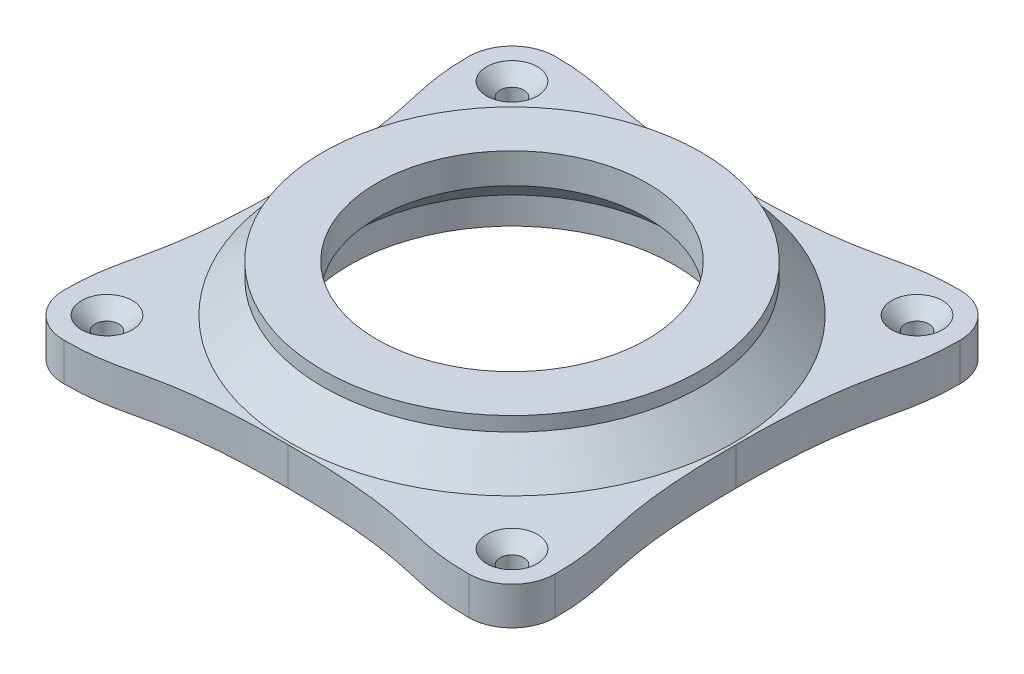
ISO-10303-21;
HEADER;
FILE_DESCRIPTION(('STEP AP214'),'2;1');
FILE_NAME('part.step','',(''),(''),'','','');
FILE_SCHEMA(('AUTOMOTIVE_DESIGN { 1 0 10303 214 1 1 1 1 }'));
ENDSEC;
DATA;
#1=APPLICATION_CONTEXT('core data for automotive mechanical design processes');
#2=APPLICATION_PROTOCOL_DEFINITION('international standard','automotive_design',2000,#1);
#3=PRODUCT_CONTEXT('',#1,'mechanical');
#4=PRODUCT('Part','Part','',(#3));
#5=PRODUCT_RELATED_PRODUCT_CATEGORY('part','',(#4));
#6=PRODUCT_DEFINITION_FORMATION('','',#4);
#7=PRODUCT_DEFINITION_CONTEXT('part definition',#1,'design');
#8=PRODUCT_DEFINITION('design','',#6,#7);
#9=PRODUCT_DEFINITION_SHAPE('','',#8);
#10=(LENGTH_UNIT() NAMED_UNIT(*) SI_UNIT(.MILLI.,.METRE.));
#11=(NAMED_UNIT(*) PLANE_ANGLE_UNIT() SI_UNIT($,.RADIAN.));
#12=(NAMED_UNIT(*) SI_UNIT($,.STERADIAN.) SOLID_ANGLE_UNIT());
#13=UNCERTAINTY_MEASURE_WITH_UNIT(LENGTH_MEASURE(1.E-05),#10,'distance_accuracy_value','');
#14=(GEOMETRIC_REPRESENTATION_CONTEXT(3) GLOBAL_UNCERTAINTY_ASSIGNED_CONTEXT((#13)) GLOBAL_UNIT_ASSIGNED_CONTEXT((#10,
#11,#12)) REPRESENTATION_CONTEXT('',''));
#15=CARTESIAN_POINT('',(0.,0.,0.));
#16=DIRECTION('',(0.,0.,1.));
#17=DIRECTION('',(1.,0.,0.));
#18=AXIS2_PLACEMENT_3D('',#15,#16,#17);
#19=CARTESIAN_POINT('',(0.,7.,0.));
#20=DIRECTION('',(0.,1.,0.));
#21=DIRECTION('',(0.,0.,1.));
#22=AXIS2_PLACEMENT_3D('',#19,#20,#21);
#23=PLANE('',#22);
#24=CARTESIAN_POINT('',(37.5,7.,-37.5));
#25=DIRECTION('',(0.,1.,0.));
#26=DIRECTION('',(0.,0.,1.));
#27=AXIS2_PLACEMENT_3D('',#24,#25,#26);
#28=CIRCLE('',#27,41.);
#29=CARTESIAN_POINT('',(37.5,7.,3.50000000000002));
#30=VERTEX_POINT('',#29);
#31=EDGE_CURVE('E11',#30,#30,#28,.F.);
#32=ORIENTED_EDGE('',*,*,#31,.T.);
#33=EDGE_LOOP('',(#32));
#34=FACE_BOUND('',#33,.T.);
#35=CARTESIAN_POINT('',(0.,7.,-75.));
#36=DIRECTION('',(0.,1.,0.));
#37=DIRECTION('',(0.,0.,1.));
#38=AXIS2_PLACEMENT_3D('',#35,#36,#37);
#39=CIRCLE('',#38,4.70000000000002);
#40=CARTESIAN_POINT('',(0.,7.,-70.3));
#41=VERTEX_POINT('',#40);
#42=EDGE_CURVE('E309',#41,#41,#39,.F.);
#43=ORIENTED_EDGE('',*,*,#42,.T.);
#44=EDGE_LOOP('',(#43));
#45=FACE_BOUND('',#44,.T.);
#46=CARTESIAN_POINT('',(0.,7.,0.));
#47=DIRECTION('',(0.,1.,0.));
#48=DIRECTION('',(0.,0.,1.));
#49=AXIS2_PLACEMENT_3D('',#46,#47,#48);
#50=CIRCLE('',#49,4.70000000000002);
#51=CARTESIAN_POINT('',(0.,7.,4.70000000000002));
#52=VERTEX_POINT('',#51);
#53=EDGE_CURVE('E306',#52,#52,#50,.F.);
#54=ORIENTED_EDGE('',*,*,#53,.T.);
#55=EDGE_LOOP('',(#54));
#56=FACE_BOUND('',#55,.T.);
#57=CARTESIAN_POINT('',(75.,7.,0.));
#58=DIRECTION('',(0.,1.,0.));
#59=DIRECTION('',(0.,0.,1.));
#60=AXIS2_PLACEMENT_3D('',#57,#58,#59);
#61=CIRCLE('',#60,4.70000000000002);
#62=CARTESIAN_POINT('',(75.,7.,4.70000000000002));
#63=VERTEX_POINT('',#62);
#64=EDGE_CURVE('E303',#63,#63,#61,.F.);
#65=ORIENTED_EDGE('',*,*,#64,.T.);
#66=EDGE_LOOP('',(#65));
#67=FACE_BOUND('',#66,.T.);
#68=CARTESIAN_POINT('',(75.0000000000007,7.,-75.0000000000004));
#69=DIRECTION('',(0.,1.,0.));
#70=DIRECTION('',(0.,0.,1.));
#71=AXIS2_PLACEMENT_3D('',#68,#69,#70);
#72=CIRCLE('',#71,4.69999999999998);
#73=CARTESIAN_POINT('',(75.0000000000007,7.,-70.3000000000004));
#74=VERTEX_POINT('',#73);
#75=EDGE_CURVE('E300',#74,#74,#72,.F.);
#76=ORIENTED_EDGE('',*,*,#75,.T.);
#77=EDGE_LOOP('',(#76));
#78=FACE_BOUND('',#77,.T.);
#79=CARTESIAN_POINT('',(0.,7.,-75.));
#80=DIRECTION('',(0.,1.,0.));
#81=DIRECTION('',(0.,0.,1.));
#82=AXIS2_PLACEMENT_3D('',#79,#80,#81);
#83=CIRCLE('',#82,8.);
#84=CARTESIAN_POINT('',(0.,7.,-83.));
#85=VERTEX_POINT('',#84);
#86=CARTESIAN_POINT('',(-8.,7.,-75.));
#87=VERTEX_POINT('',#86);
#88=EDGE_CURVE('E386',#85,#87,#83,.T.);
#89=ORIENTED_EDGE('',*,*,#88,.T.);
#90=CARTESIAN_POINT('',(-7.99999999999906,7.,-74.9999999999999));
#91=CARTESIAN_POINT('',(-7.99999999999922,7.,-62.4999999999999));
#92=CARTESIAN_POINT('',(-4.,7.,-62.5));
#93=CARTESIAN_POINT('',(-4.,7.,-37.5));
#94=B_SPLINE_CURVE_WITH_KNOTS('',3,(#90,#91,#92,#93),.UNSPECIFIED.,.F.,.F.,(4,4),(0.,1.),.UNSPECIFIED.);
#95=CARTESIAN_POINT('',(-4.,7.,-37.5));
#96=VERTEX_POINT('',#95);
#97=EDGE_CURVE('E109',#87,#96,#94,.T.);
#98=ORIENTED_EDGE('',*,*,#97,.T.);
#99=CARTESIAN_POINT('',(-7.99999999999987,7.,0.));
#100=CARTESIAN_POINT('',(-7.99999999999974,7.,-12.4999999999999));
#101=CARTESIAN_POINT('',(-4.00000000000002,7.,-12.5));
#102=CARTESIAN_POINT('',(-4.,7.,-37.5));
#103=B_SPLINE_CURVE_WITH_KNOTS('',3,(#99,#100,#101,#102),.UNSPECIFIED.,.F.,.F.,(4,4),(0.,1.),.UNSPECIFIED.);
#104=CARTESIAN_POINT('',(-7.99999999999915,7.,-2.93902320845243E-13));
#105=VERTEX_POINT('',#104);
#106=EDGE_CURVE('E238',#105,#96,#103,.T.);
#107=ORIENTED_EDGE('',*,*,#106,.F.);
#108=CARTESIAN_POINT('',(8.46545056276682E-13,7.,-2.4980018054066E-13));
#109=DIRECTION('',(0.,1.,0.));
#110=DIRECTION('',(0.,0.,1.));
#111=AXIS2_PLACEMENT_3D('',#108,#109,#110);
#112=CIRCLE('',#111,8.);
#113=CARTESIAN_POINT('',(8.46545056276682E-13,7.,7.99999999999975));
#114=VERTEX_POINT('',#113);
#115=EDGE_CURVE('E243',#105,#114,#112,.T.);
#116=ORIENTED_EDGE('',*,*,#115,.T.);
#117=CARTESIAN_POINT('',(7.91033905045424E-13,7.,7.99999999999974));
#118=CARTESIAN_POINT('',(12.5000000000008,7.,7.99999999999985));
#119=CARTESIAN_POINT('',(12.5,7.,4.00000000000005));
#120=CARTESIAN_POINT('',(37.5,7.,4.00000000000003));
#121=B_SPLINE_CURVE_WITH_KNOTS('',3,(#117,#118,#119,#120),.UNSPECIFIED.,.F.,.F.,(4,4),(0.,1.),.UNSPECIFIED.);
#122=CARTESIAN_POINT('',(37.5,7.,4.00000000000003));
#123=VERTEX_POINT('',#122);
#124=EDGE_CURVE('E208',#114,#123,#121,.T.);
#125=ORIENTED_EDGE('',*,*,#124,.T.);
#126=CARTESIAN_POINT('',(75.0000000000008,7.,8.00000000000028));
#127=CARTESIAN_POINT('',(62.5000000000008,7.,8.0000000000002));
#128=CARTESIAN_POINT('',(62.5,7.,4.00000000000003));
#129=CARTESIAN_POINT('',(37.5,7.,4.00000000000003));
#130=B_SPLINE_CURVE_WITH_KNOTS('',3,(#126,#127,#128,#129),.UNSPECIFIED.,.F.,.F.,(4,4),(0.,1.),.UNSPECIFIED.);
#131=CARTESIAN_POINT('',(75.0000000000005,7.,7.99999999999959));
#132=VERTEX_POINT('',#131);
#133=EDGE_CURVE('E202',#132,#123,#130,.T.);
#134=ORIENTED_EDGE('',*,*,#133,.F.);
#135=CARTESIAN_POINT('',(75.0000000000005,7.,-4.02455846426619E-13));
#136=DIRECTION('',(0.,1.,0.));
#137=DIRECTION('',(0.,0.,1.));
#138=AXIS2_PLACEMENT_3D('',#135,#136,#137);
#139=CIRCLE('',#138,7.99999999999999);
#140=CARTESIAN_POINT('',(83.0000000000005,7.,-3.73544278276556E-13));
#141=VERTEX_POINT('',#140);
#142=EDGE_CURVE('E197',#132,#141,#139,.T.);
#143=ORIENTED_EDGE('',*,*,#142,.T.);
#144=CARTESIAN_POINT('',(83.0000000000004,7.,-3.7470027081099E-13));
#145=CARTESIAN_POINT('',(83.0000000000005,7.,-12.5000000000004));
#146=CARTESIAN_POINT('',(79.,7.,-12.5));
#147=CARTESIAN_POINT('',(79.,7.,-37.5));
#148=B_SPLINE_CURVE_WITH_KNOTS('',3,(#144,#145,#146,#147),.UNSPECIFIED.,.F.,.F.,(4,4),(0.,1.),.UNSPECIFIED.);
#149=CARTESIAN_POINT('',(79.,7.,-37.5));
#150=VERTEX_POINT('',#149);
#151=EDGE_CURVE('E189',#141,#150,#148,.T.);
#152=ORIENTED_EDGE('',*,*,#151,.T.);
#153=CARTESIAN_POINT('',(83.0000000000007,7.,-75.0000000000004));
#154=CARTESIAN_POINT('',(83.0000000000007,7.,-62.5000000000004));
#155=CARTESIAN_POINT('',(79.,7.,-62.5));
#156=CARTESIAN_POINT('',(79.,7.,-37.5));
#157=B_SPLINE_CURVE_WITH_KNOTS('',3,(#153,#154,#155,#156),.UNSPECIFIED.,.F.,.F.,(4,4),(0.,1.),.UNSPECIFIED.);
#158=CARTESIAN_POINT('',(83.0000000000002,7.,-75.));
#159=VERTEX_POINT('',#158);
#160=EDGE_CURVE('E143',#159,#150,#157,.T.);
#161=ORIENTED_EDGE('',*,*,#160,.F.);
#162=CARTESIAN_POINT('',(75.0000000000007,7.,-75.0000000000004));
#163=DIRECTION('',(0.,1.,0.));
#164=DIRECTION('',(0.,0.,1.));
#165=AXIS2_PLACEMENT_3D('',#162,#163,#164);
#166=CIRCLE('',#165,7.99999999999945);
#167=CARTESIAN_POINT('',(75.,7.,-82.9999999999999));
#168=VERTEX_POINT('',#167);
#169=EDGE_CURVE('E137',#159,#168,#166,.T.);
#170=ORIENTED_EDGE('',*,*,#169,.T.);
#171=CARTESIAN_POINT('',(75.,7.,-83.));
#172=CARTESIAN_POINT('',(62.5,7.,-83.));
#173=CARTESIAN_POINT('',(62.5,7.,-79.));
#174=CARTESIAN_POINT('',(37.5,7.,-79.));
#175=B_SPLINE_CURVE_WITH_KNOTS('',3,(#171,#172,#173,#174),.UNSPECIFIED.,.F.,.F.,(4,4),(0.,1.),.UNSPECIFIED.);
#176=CARTESIAN_POINT('',(37.5,7.,-79.));
#177=VERTEX_POINT('',#176);
#178=EDGE_CURVE('E141',#168,#177,#175,.T.);
#179=ORIENTED_EDGE('',*,*,#178,.T.);
#180=CARTESIAN_POINT('',(0.,7.,-83.));
#181=CARTESIAN_POINT('',(12.5,7.,-83.));
#182=CARTESIAN_POINT('',(12.5,7.,-79.));
#183=CARTESIAN_POINT('',(37.5,7.,-79.));
#184=B_SPLINE_CURVE_WITH_KNOTS('',3,(#180,#181,#182,#183),.UNSPECIFIED.,.F.,.F.,(4,4),(0.,1.),.UNSPECIFIED.);
#185=EDGE_CURVE('E156',#85,#177,#184,.T.);
#186=ORIENTED_EDGE('',*,*,#185,.F.);
#187=EDGE_LOOP('',(#89,#98,#107,#116,#125,#134,#143,#152,#161,#170,#179,#186));
#188=FACE_BOUND('',#187,.T.);
#189=ADVANCED_FACE('F39',(#34,#45,#56,#67,#78,#188),#23,.T.);
#190=CARTESIAN_POINT('',(0.,7.,-75.));
#191=DIRECTION('',(0.,-1.,0.));
#192=DIRECTION('',(0.,0.,-1.));
#193=AXIS2_PLACEMENT_3D('',#190,#191,#192);
#194=CYLINDRICAL_SURFACE('',#193,8.);
#195=CARTESIAN_POINT('',(0.,0.,-75.));
#196=DIRECTION('',(0.,1.,0.));
#197=DIRECTION('',(0.,0.,1.));
#198=AXIS2_PLACEMENT_3D('',#195,#196,#197);
#199=CIRCLE('',#198,8.);
#200=CARTESIAN_POINT('',(0.,0.,-83.));
#201=VERTEX_POINT('',#200);
#202=CARTESIAN_POINT('',(-8.,0.,-75.));
#203=VERTEX_POINT('',#202);
#204=EDGE_CURVE('E379',#201,#203,#199,.T.);
#205=ORIENTED_EDGE('',*,*,#204,.T.);
#206=DIRECTION('',(0.,-1.,0.));
#207=VECTOR('',#206,1.);
#208=CARTESIAN_POINT('',(-8.,7.,-75.));
#209=LINE('',#208,#207);
#210=EDGE_CURVE('E295',#87,#203,#209,.T.);
#211=ORIENTED_EDGE('',*,*,#210,.F.);
#212=ORIENTED_EDGE('',*,*,#88,.F.);
#213=DIRECTION('',(0.,-1.,0.));
#214=VECTOR('',#213,1.);
#215=CARTESIAN_POINT('',(0.,7.,-83.));
#216=LINE('',#215,#214);
#217=EDGE_CURVE('E57',#85,#201,#216,.T.);
#218=ORIENTED_EDGE('',*,*,#217,.T.);
#219=EDGE_LOOP('',(#205,#211,#212,#218));
#220=FACE_BOUND('',#219,.T.);
#221=ADVANCED_FACE('F341',(#220),#194,.T.);
#222=DIRECTION('',(0.,-1.,0.));
#223=VECTOR('',#222,1.);
#224=SURFACE_OF_LINEAR_EXTRUSION('',#94,#223);
#225=CARTESIAN_POINT('',(-7.99999999999906,0.,-74.9999999999999));
#226=CARTESIAN_POINT('',(-7.99999999999922,0.,-62.4999999999999));
#227=CARTESIAN_POINT('',(-4.,0.,-62.5));
#228=CARTESIAN_POINT('',(-4.,0.,-37.5));
#229=B_SPLINE_CURVE_WITH_KNOTS('',3,(#225,#226,#227,#228),.UNSPECIFIED.,.F.,.F.,(4,4),(0.,1.),.UNSPECIFIED.);
#230=CARTESIAN_POINT('',(-4.,0.,-37.5));
#231=VERTEX_POINT('',#230);
#232=EDGE_CURVE('E383',#203,#231,#229,.T.);
#233=ORIENTED_EDGE('',*,*,#232,.T.);
#234=DIRECTION('',(0.,-1.,0.));
#235=VECTOR('',#234,1.);
#236=CARTESIAN_POINT('',(-4.,7.,-37.5));
#237=LINE('',#236,#235);
#238=EDGE_CURVE('E293',#96,#231,#237,.T.);
#239=ORIENTED_EDGE('',*,*,#238,.F.);
#240=ORIENTED_EDGE('',*,*,#97,.F.);
#241=ORIENTED_EDGE('',*,*,#210,.T.);
#242=EDGE_LOOP('',(#233,#239,#240,#241));
#243=FACE_BOUND('',#242,.T.);
#244=ADVANCED_FACE('F234',(#243),#224,.F.);
#245=DIRECTION('',(0.,-1.,0.));
#246=VECTOR('',#245,1.);
#247=SURFACE_OF_LINEAR_EXTRUSION('',#103,#246);
#248=CARTESIAN_POINT('',(-7.99999999999987,0.,0.));
#249=CARTESIAN_POINT('',(-7.99999999999974,0.,-12.4999999999999));
#250=CARTESIAN_POINT('',(-4.00000000000002,0.,-12.5));
#251=CARTESIAN_POINT('',(-4.,0.,-37.5));
#252=B_SPLINE_CURVE_WITH_KNOTS('',3,(#248,#249,#250,#251),.UNSPECIFIED.,.F.,.F.,(4,4),(0.,1.),.UNSPECIFIED.);
#253=CARTESIAN_POINT('',(-7.99999999999915,0.,-2.93902320845243E-13));
#254=VERTEX_POINT('',#253);
#255=EDGE_CURVE('E431',#254,#231,#252,.T.);
#256=ORIENTED_EDGE('',*,*,#255,.F.);
#257=DIRECTION('',(0.,-1.,0.));
#258=VECTOR('',#257,1.);
#259=CARTESIAN_POINT('',(-7.99999999999915,7.,-2.93902320845243E-13));
#260=LINE('',#259,#258);
#261=EDGE_CURVE('E291',#105,#254,#260,.T.);
#262=ORIENTED_EDGE('',*,*,#261,.F.);
#263=ORIENTED_EDGE('',*,*,#106,.T.);
#264=ORIENTED_EDGE('',*,*,#238,.T.);
#265=EDGE_LOOP('',(#256,#262,#263,#264));
#266=FACE_BOUND('',#265,.T.);
#267=ADVANCED_FACE('F229',(#266),#247,.T.);
#268=CARTESIAN_POINT('',(8.46545056276682E-13,7.,-2.4980018054066E-13));
#269=DIRECTION('',(0.,-1.,0.));
#270=DIRECTION('',(0.,0.,-1.));
#271=AXIS2_PLACEMENT_3D('',#268,#269,#270);
#272=CYLINDRICAL_SURFACE('',#271,8.);
#273=CARTESIAN_POINT('',(8.46545056276682E-13,0.,-2.4980018054066E-13));
#274=DIRECTION('',(0.,1.,0.));
#275=DIRECTION('',(0.,0.,1.));
#276=AXIS2_PLACEMENT_3D('',#273,#274,#275);
#277=CIRCLE('',#276,8.);
#278=CARTESIAN_POINT('',(8.46545056276682E-13,0.,7.99999999999975));
#279=VERTEX_POINT('',#278);
#280=EDGE_CURVE('E426',#254,#279,#277,.T.);
#281=ORIENTED_EDGE('',*,*,#280,.T.);
#282=DIRECTION('',(0.,-1.,0.));
#283=VECTOR('',#282,1.);
#284=CARTESIAN_POINT('',(8.46545056276682E-13,7.,7.99999999999975));
#285=LINE('',#284,#283);
#286=EDGE_CURVE('E264',#114,#279,#285,.T.);
#287=ORIENTED_EDGE('',*,*,#286,.F.);
#288=ORIENTED_EDGE('',*,*,#115,.F.);
#289=ORIENTED_EDGE('',*,*,#261,.T.);
#290=EDGE_LOOP('',(#281,#287,#288,#289));
#291=FACE_BOUND('',#290,.T.);
#292=ADVANCED_FACE('F225',(#291),#272,.T.);
#293=DIRECTION('',(0.,-1.,0.));
#294=VECTOR('',#293,1.);
#295=SURFACE_OF_LINEAR_EXTRUSION('',#121,#294);
#296=CARTESIAN_POINT('',(7.91033905045424E-13,0.,7.99999999999974));
#297=CARTESIAN_POINT('',(12.5000000000008,0.,7.99999999999985));
#298=CARTESIAN_POINT('',(12.5,0.,4.00000000000005));
#299=CARTESIAN_POINT('',(37.5,0.,4.00000000000003));
#300=B_SPLINE_CURVE_WITH_KNOTS('',3,(#296,#297,#298,#299),.UNSPECIFIED.,.F.,.F.,(4,4),(0.,1.),.UNSPECIFIED.);
#301=CARTESIAN_POINT('',(37.5,0.,4.00000000000003));
#302=VERTEX_POINT('',#301);
#303=EDGE_CURVE('E261',#279,#302,#300,.T.);
#304=ORIENTED_EDGE('',*,*,#303,.T.);
#305=DIRECTION('',(0.,-1.,0.));
#306=VECTOR('',#305,1.);
#307=CARTESIAN_POINT('',(37.5,7.,4.00000000000003));
#308=LINE('',#307,#306);
#309=EDGE_CURVE('E259',#123,#302,#308,.T.);
#310=ORIENTED_EDGE('',*,*,#309,.F.);
#311=ORIENTED_EDGE('',*,*,#124,.F.);
#312=ORIENTED_EDGE('',*,*,#286,.T.);
#313=EDGE_LOOP('',(#304,#310,#311,#312));
#314=FACE_BOUND('',#313,.T.);
#315=ADVANCED_FACE('F221',(#314),#295,.F.);
#316=DIRECTION('',(0.,-1.,0.));
#317=VECTOR('',#316,1.);
#318=SURFACE_OF_LINEAR_EXTRUSION('',#130,#317);
#319=CARTESIAN_POINT('',(75.0000000000008,0.,8.00000000000028));
#320=CARTESIAN_POINT('',(62.5000000000008,0.,8.0000000000002));
#321=CARTESIAN_POINT('',(62.5,0.,4.00000000000003));
#322=CARTESIAN_POINT('',(37.5,0.,4.00000000000003));
#323=B_SPLINE_CURVE_WITH_KNOTS('',3,(#319,#320,#321,#322),.UNSPECIFIED.,.F.,.F.,(4,4),(0.,1.),.UNSPECIFIED.);
#324=CARTESIAN_POINT('',(75.0000000000005,0.,7.99999999999959));
#325=VERTEX_POINT('',#324);
#326=EDGE_CURVE('E268',#325,#302,#323,.T.);
#327=ORIENTED_EDGE('',*,*,#326,.F.);
#328=DIRECTION('',(0.,-1.,0.));
#329=VECTOR('',#328,1.);
#330=CARTESIAN_POINT('',(75.0000000000005,7.,7.99999999999959));
#331=LINE('',#330,#329);
#332=EDGE_CURVE('E265',#132,#325,#331,.T.);
#333=ORIENTED_EDGE('',*,*,#332,.F.);
#334=ORIENTED_EDGE('',*,*,#133,.T.);
#335=ORIENTED_EDGE('',*,*,#309,.T.);
#336=EDGE_LOOP('',(#327,#333,#334,#335));
#337=FACE_BOUND('',#336,.T.);
#338=ADVANCED_FACE('F217',(#337),#318,.T.);
#339=CARTESIAN_POINT('',(75.0000000000005,7.,-4.02455846426619E-13));
#340=DIRECTION('',(0.,-1.,0.));
#341=DIRECTION('',(0.,0.,-1.));
#342=AXIS2_PLACEMENT_3D('',#339,#340,#341);
#343=CYLINDRICAL_SURFACE('',#342,7.99999999999999);
#344=CARTESIAN_POINT('',(75.0000000000005,0.,-4.02455846426619E-13));
#345=DIRECTION('',(0.,1.,0.));
#346=DIRECTION('',(0.,0.,1.));
#347=AXIS2_PLACEMENT_3D('',#344,#345,#346);
#348=CIRCLE('',#347,7.99999999999999);
#349=CARTESIAN_POINT('',(83.0000000000005,0.,-3.73544278276556E-13));
#350=VERTEX_POINT('',#349);
#351=EDGE_CURVE('E412',#325,#350,#348,.T.);
#352=ORIENTED_EDGE('',*,*,#351,.T.);
#353=DIRECTION('',(0.,-1.,0.));
#354=VECTOR('',#353,1.);
#355=CARTESIAN_POINT('',(83.0000000000005,7.,-3.73544278276556E-13));
#356=LINE('',#355,#354);
#357=EDGE_CURVE('E271',#141,#350,#356,.T.);
#358=ORIENTED_EDGE('',*,*,#357,.F.);
#359=ORIENTED_EDGE('',*,*,#142,.F.);
#360=ORIENTED_EDGE('',*,*,#332,.T.);
#361=EDGE_LOOP('',(#352,#358,#359,#360));
#362=FACE_BOUND('',#361,.T.);
#363=ADVANCED_FACE('F220',(#362),#343,.T.);
#364=DIRECTION('',(0.,-1.,0.));
#365=VECTOR('',#364,1.);
#366=SURFACE_OF_LINEAR_EXTRUSION('',#148,#365);
#367=CARTESIAN_POINT('',(83.0000000000004,0.,-3.7470027081099E-13));
#368=CARTESIAN_POINT('',(83.0000000000005,0.,-12.5000000000004));
#369=CARTESIAN_POINT('',(79.,0.,-12.5));
#370=CARTESIAN_POINT('',(79.,0.,-37.5));
#371=B_SPLINE_CURVE_WITH_KNOTS('',3,(#367,#368,#369,#370),.UNSPECIFIED.,.F.,.F.,(4,4),(0.,1.),.UNSPECIFIED.);
#372=CARTESIAN_POINT('',(79.,0.,-37.5));
#373=VERTEX_POINT('',#372);
#374=EDGE_CURVE('E281',#350,#373,#371,.T.);
#375=ORIENTED_EDGE('',*,*,#374,.T.);
#376=DIRECTION('',(0.,-1.,0.));
#377=VECTOR('',#376,1.);
#378=CARTESIAN_POINT('',(79.,7.,-37.5));
#379=LINE('',#378,#377);
#380=EDGE_CURVE('E279',#150,#373,#379,.T.);
#381=ORIENTED_EDGE('',*,*,#380,.F.);
#382=ORIENTED_EDGE('',*,*,#151,.F.);
#383=ORIENTED_EDGE('',*,*,#357,.T.);
#384=EDGE_LOOP('',(#375,#381,#382,#383));
#385=FACE_BOUND('',#384,.T.);
#386=ADVANCED_FACE('F182',(#385),#366,.F.);
#387=DIRECTION('',(0.,-1.,0.));
#388=VECTOR('',#387,1.);
#389=SURFACE_OF_LINEAR_EXTRUSION('',#157,#388);
#390=CARTESIAN_POINT('',(83.0000000000007,0.,-75.0000000000004));
#391=CARTESIAN_POINT('',(83.0000000000007,0.,-62.5000000000004));
#392=CARTESIAN_POINT('',(79.,0.,-62.5));
#393=CARTESIAN_POINT('',(79.,0.,-37.5));
#394=B_SPLINE_CURVE_WITH_KNOTS('',3,(#390,#391,#392,#393),.UNSPECIFIED.,.F.,.F.,(4,4),(0.,1.),.UNSPECIFIED.);
#395=CARTESIAN_POINT('',(83.0000000000002,0.,-75.));
#396=VERTEX_POINT('',#395);
#397=EDGE_CURVE('E285',#396,#373,#394,.T.);
#398=ORIENTED_EDGE('',*,*,#397,.F.);
#399=DIRECTION('',(0.,-1.,0.));
#400=VECTOR('',#399,1.);
#401=CARTESIAN_POINT('',(83.0000000000002,7.,-75.));
#402=LINE('',#401,#400);
#403=EDGE_CURVE('E153',#159,#396,#402,.T.);
#404=ORIENTED_EDGE('',*,*,#403,.F.);
#405=ORIENTED_EDGE('',*,*,#160,.T.);
#406=ORIENTED_EDGE('',*,*,#380,.T.);
#407=EDGE_LOOP('',(#398,#404,#405,#406));
#408=FACE_BOUND('',#407,.T.);
#409=ADVANCED_FACE('F179',(#408),#389,.T.);
#410=CARTESIAN_POINT('',(75.0000000000007,7.,-75.0000000000004));
#411=DIRECTION('',(0.,-1.,0.));
#412=DIRECTION('',(0.,0.,-1.));
#413=AXIS2_PLACEMENT_3D('',#410,#411,#412);
#414=CYLINDRICAL_SURFACE('',#413,7.99999999999945);
#415=CARTESIAN_POINT('',(75.0000000000007,0.,-75.0000000000004));
#416=DIRECTION('',(0.,1.,0.));
#417=DIRECTION('',(0.,0.,1.));
#418=AXIS2_PLACEMENT_3D('',#415,#416,#417);
#419=CIRCLE('',#418,7.99999999999945);
#420=CARTESIAN_POINT('',(75.,0.,-82.9999999999999));
#421=VERTEX_POINT('',#420);
#422=EDGE_CURVE('E150',#396,#421,#419,.T.);
#423=ORIENTED_EDGE('',*,*,#422,.T.);
#424=DIRECTION('',(0.,-1.,0.));
#425=VECTOR('',#424,1.);
#426=CARTESIAN_POINT('',(75.,7.,-82.9999999999999));
#427=LINE('',#426,#425);
#428=EDGE_CURVE('E147',#168,#421,#427,.T.);
#429=ORIENTED_EDGE('',*,*,#428,.F.);
#430=ORIENTED_EDGE('',*,*,#169,.F.);
#431=ORIENTED_EDGE('',*,*,#403,.T.);
#432=EDGE_LOOP('',(#423,#429,#430,#431));
#433=FACE_BOUND('',#432,.T.);
#434=ADVANCED_FACE('F148',(#433),#414,.T.);
#435=DIRECTION('',(0.,-1.,0.));
#436=VECTOR('',#435,1.);
#437=SURFACE_OF_LINEAR_EXTRUSION('',#175,#436);
#438=CARTESIAN_POINT('',(75.,0.,-83.));
#439=CARTESIAN_POINT('',(62.5,0.,-83.));
#440=CARTESIAN_POINT('',(62.5,0.,-79.));
#441=CARTESIAN_POINT('',(37.5,0.,-79.));
#442=B_SPLINE_CURVE_WITH_KNOTS('',3,(#438,#439,#440,#441),.UNSPECIFIED.,.F.,.F.,(4,4),(0.,1.),.UNSPECIFIED.);
#443=CARTESIAN_POINT('',(37.5,0.,-79.));
#444=VERTEX_POINT('',#443);
#445=EDGE_CURVE('E387',#421,#444,#442,.T.);
#446=ORIENTED_EDGE('',*,*,#445,.T.);
#447=DIRECTION('',(0.,-1.,0.));
#448=VECTOR('',#447,1.);
#449=CARTESIAN_POINT('',(37.5,7.,-79.));
#450=LINE('',#449,#448);
#451=EDGE_CURVE('E96',#177,#444,#450,.T.);
#452=ORIENTED_EDGE('',*,*,#451,.F.);
#453=ORIENTED_EDGE('',*,*,#178,.F.);
#454=ORIENTED_EDGE('',*,*,#428,.T.);
#455=EDGE_LOOP('',(#446,#452,#453,#454));
#456=FACE_BOUND('',#455,.T.);
#457=ADVANCED_FACE('F155',(#456),#437,.F.);
#458=CARTESIAN_POINT('',(37.5,7.,-37.5));
#459=DIRECTION('',(0.,-1.,0.));
#460=DIRECTION('',(0.,0.,-1.));
#461=AXIS2_PLACEMENT_3D('',#458,#459,#460);
#462=CYLINDRICAL_SURFACE('',#461,25.05);
#463=CARTESIAN_POINT('',(37.5,10.0500000000001,-37.5));
#464=DIRECTION('',(0.,-1.,0.));
#465=DIRECTION('',(0.,0.,-1.));
#466=AXIS2_PLACEMENT_3D('',#463,#464,#465);
#467=CIRCLE('',#466,25.05);
#468=CARTESIAN_POINT('',(37.5,10.0500000000001,-62.55));
#469=VERTEX_POINT('',#468);
#470=EDGE_CURVE('E448',#469,#469,#467,.T.);
#471=ORIENTED_EDGE('',*,*,#470,.T.);
#472=EDGE_LOOP('',(#471));
#473=FACE_BOUND('',#472,.T.);
#474=CARTESIAN_POINT('',(37.5,15.6500000000001,-37.5));
#475=DIRECTION('',(0.,1.,0.));
#476=DIRECTION('',(0.,0.,1.));
#477=AXIS2_PLACEMENT_3D('',#474,#475,#476);
#478=CIRCLE('',#477,25.05);
#479=CARTESIAN_POINT('',(37.5,15.6500000000001,-12.45));
#480=VERTEX_POINT('',#479);
#481=EDGE_CURVE('E459',#480,#480,#478,.T.);
#482=ORIENTED_EDGE('',*,*,#481,.T.);
#483=EDGE_LOOP('',(#482));
#484=FACE_BOUND('',#483,.T.);
#485=ADVANCED_FACE('F174',(#473,#484),#462,.F.);
#486=CARTESIAN_POINT('',(0.,7.,0.));
#487=DIRECTION('',(0.,-1.,0.));
#488=DIRECTION('',(0.,0.,-1.));
#489=AXIS2_PLACEMENT_3D('',#486,#487,#488);
#490=CYLINDRICAL_SURFACE('',#489,2.2);
#491=CARTESIAN_POINT('',(0.,4.49999999999998,0.));
#492=DIRECTION('',(0.,1.,0.));
#493=DIRECTION('',(0.,0.,1.));
#494=AXIS2_PLACEMENT_3D('',#491,#492,#493);
#495=CIRCLE('',#494,2.2);
#496=CARTESIAN_POINT('',(0.,4.49999999999998,2.2));
#497=VERTEX_POINT('',#496);
#498=EDGE_CURVE('E312',#497,#497,#495,.T.);
#499=ORIENTED_EDGE('',*,*,#498,.T.);
#500=EDGE_LOOP('',(#499));
#501=FACE_BOUND('',#500,.T.);
#502=CARTESIAN_POINT('',(0.,0.,0.));
#503=DIRECTION('',(0.,1.,0.));
#504=DIRECTION('',(0.,0.,1.));
#505=AXIS2_PLACEMENT_3D('',#502,#503,#504);
#506=CIRCLE('',#505,2.2);
#507=CARTESIAN_POINT('',(0.,0.,2.2));
#508=VERTEX_POINT('',#507);
#509=EDGE_CURVE('E377',#508,#508,#506,.T.);
#510=ORIENTED_EDGE('',*,*,#509,.F.);
#511=EDGE_LOOP('',(#510));
#512=FACE_BOUND('',#511,.T.);
#513=ADVANCED_FACE('F479',(#501,#512),#490,.F.);
#514=CARTESIAN_POINT('',(75.,7.,0.));
#515=DIRECTION('',(0.,-1.,0.));
#516=DIRECTION('',(0.,0.,-1.));
#517=AXIS2_PLACEMENT_3D('',#514,#515,#516);
#518=CYLINDRICAL_SURFACE('',#517,2.2);
#519=CARTESIAN_POINT('',(75.,4.49999999999998,0.));
#520=DIRECTION('',(0.,1.,0.));
#521=DIRECTION('',(0.,0.,1.));
#522=AXIS2_PLACEMENT_3D('',#519,#520,#521);
#523=CIRCLE('',#522,2.2);
#524=CARTESIAN_POINT('',(75.,4.49999999999998,2.2));
#525=VERTEX_POINT('',#524);
#526=EDGE_CURVE('E315',#525,#525,#523,.T.);
#527=ORIENTED_EDGE('',*,*,#526,.T.);
#528=EDGE_LOOP('',(#527));
#529=FACE_BOUND('',#528,.T.);
#530=CARTESIAN_POINT('',(75.,0.,0.));
#531=DIRECTION('',(0.,1.,0.));
#532=DIRECTION('',(0.,0.,1.));
#533=AXIS2_PLACEMENT_3D('',#530,#531,#532);
#534=CIRCLE('',#533,2.2);
#535=CARTESIAN_POINT('',(75.,0.,2.2));
#536=VERTEX_POINT('',#535);
#537=EDGE_CURVE('E373',#536,#536,#534,.T.);
#538=ORIENTED_EDGE('',*,*,#537,.F.);
#539=EDGE_LOOP('',(#538));
#540=FACE_BOUND('',#539,.T.);
#541=ADVANCED_FACE('F484',(#529,#540),#518,.F.);
#542=CARTESIAN_POINT('',(75.0000000000007,7.,-75.0000000000004));
#543=DIRECTION('',(0.,-1.,0.));
#544=DIRECTION('',(0.,0.,-1.));
#545=AXIS2_PLACEMENT_3D('',#542,#543,#544);
#546=CYLINDRICAL_SURFACE('',#545,2.2);
#547=CARTESIAN_POINT('',(75.0000000000007,4.50000000000002,-75.0000000000004));
#548=DIRECTION('',(0.,1.,0.));
#549=DIRECTION('',(0.,0.,1.));
#550=AXIS2_PLACEMENT_3D('',#547,#548,#549);
#551=CIRCLE('',#550,2.2);
#552=CARTESIAN_POINT('',(75.0000000000007,4.50000000000002,-72.8000000000004));
#553=VERTEX_POINT('',#552);
#554=EDGE_CURVE('E318',#553,#553,#551,.T.);
#555=ORIENTED_EDGE('',*,*,#554,.T.);
#556=EDGE_LOOP('',(#555));
#557=FACE_BOUND('',#556,.T.);
#558=CARTESIAN_POINT('',(75.0000000000007,0.,-75.0000000000004));
#559=DIRECTION('',(0.,1.,0.));
#560=DIRECTION('',(0.,0.,1.));
#561=AXIS2_PLACEMENT_3D('',#558,#559,#560);
#562=CIRCLE('',#561,2.2);
#563=CARTESIAN_POINT('',(75.0000000000007,0.,-72.8000000000004));
#564=VERTEX_POINT('',#563);
#565=EDGE_CURVE('E369',#564,#564,#562,.T.);
#566=ORIENTED_EDGE('',*,*,#565,.F.);
#567=EDGE_LOOP('',(#566));
#568=FACE_BOUND('',#567,.T.);
#569=ADVANCED_FACE('F490',(#557,#568),#546,.F.);
#570=CARTESIAN_POINT('',(0.,7.,-75.));
#571=DIRECTION('',(0.,-1.,0.));
#572=DIRECTION('',(0.,0.,-1.));
#573=AXIS2_PLACEMENT_3D('',#570,#571,#572);
#574=CYLINDRICAL_SURFACE('',#573,2.2);
#575=CARTESIAN_POINT('',(0.,4.49999999999998,-75.));
#576=DIRECTION('',(0.,1.,0.));
#577=DIRECTION('',(0.,0.,1.));
#578=AXIS2_PLACEMENT_3D('',#575,#576,#577);
#579=CIRCLE('',#578,2.2);
#580=CARTESIAN_POINT('',(0.,4.49999999999998,-72.8));
#581=VERTEX_POINT('',#580);
#582=EDGE_CURVE('E297',#581,#581,#579,.T.);
#583=ORIENTED_EDGE('',*,*,#582,.T.);
#584=EDGE_LOOP('',(#583));
#585=FACE_BOUND('',#584,.T.);
#586=CARTESIAN_POINT('',(0.,0.,-75.));
#587=DIRECTION('',(0.,1.,0.));
#588=DIRECTION('',(0.,0.,1.));
#589=AXIS2_PLACEMENT_3D('',#586,#587,#588);
#590=CIRCLE('',#589,2.2);
#591=CARTESIAN_POINT('',(0.,0.,-72.8));
#592=VERTEX_POINT('',#591);
#593=EDGE_CURVE('E365',#592,#592,#590,.T.);
#594=ORIENTED_EDGE('',*,*,#593,.F.);
#595=EDGE_LOOP('',(#594));
#596=FACE_BOUND('',#595,.T.);
#597=ADVANCED_FACE('F357',(#585,#596),#574,.F.);
#598=DIRECTION('',(0.,-1.,0.));
#599=VECTOR('',#598,1.);
#600=SURFACE_OF_LINEAR_EXTRUSION('',#184,#599);
#601=CARTESIAN_POINT('',(0.,0.,-83.));
#602=CARTESIAN_POINT('',(12.5,0.,-83.));
#603=CARTESIAN_POINT('',(12.5,0.,-79.));
#604=CARTESIAN_POINT('',(37.5,0.,-79.));
#605=B_SPLINE_CURVE_WITH_KNOTS('',3,(#601,#602,#603,#604),.UNSPECIFIED.,.F.,.F.,(4,4),(0.,1.),.UNSPECIFIED.);
#606=EDGE_CURVE('E380',#201,#444,#605,.T.);
#607=ORIENTED_EDGE('',*,*,#606,.F.);
#608=ORIENTED_EDGE('',*,*,#217,.F.);
#609=ORIENTED_EDGE('',*,*,#185,.T.);
#610=ORIENTED_EDGE('',*,*,#451,.T.);
#611=EDGE_LOOP('',(#607,#608,#609,#610));
#612=FACE_BOUND('',#611,.T.);
#613=ADVANCED_FACE('F175',(#612),#600,.T.);
#614=CARTESIAN_POINT('',(0.,0.,0.));
#615=DIRECTION('',(0.,1.,0.));
#616=DIRECTION('',(0.,0.,1.));
#617=AXIS2_PLACEMENT_3D('',#614,#615,#616);
#618=PLANE('',#617);
#619=CARTESIAN_POINT('',(37.5,0.,-37.5));
#620=DIRECTION('',(0.,-1.,0.));
#621=DIRECTION('',(0.,0.,-1.));
#622=AXIS2_PLACEMENT_3D('',#619,#620,#621);
#623=CIRCLE('',#622,30.1);
#624=CARTESIAN_POINT('',(37.5,0.,-67.6));
#625=VERTEX_POINT('',#624);
#626=EDGE_CURVE('E361',#625,#625,#623,.T.);
#627=ORIENTED_EDGE('',*,*,#626,.F.);
#628=EDGE_LOOP('',(#627));
#629=FACE_BOUND('',#628,.T.);
#630=ORIENTED_EDGE('',*,*,#593,.T.);
#631=EDGE_LOOP('',(#630));
#632=FACE_BOUND('',#631,.T.);
#633=ORIENTED_EDGE('',*,*,#565,.T.);
#634=EDGE_LOOP('',(#633));
#635=FACE_BOUND('',#634,.T.);
#636=ORIENTED_EDGE('',*,*,#537,.T.);
#637=EDGE_LOOP('',(#636));
#638=FACE_BOUND('',#637,.T.);
#639=ORIENTED_EDGE('',*,*,#509,.T.);
#640=EDGE_LOOP('',(#639));
#641=FACE_BOUND('',#640,.T.);
#642=ORIENTED_EDGE('',*,*,#204,.F.);
#643=ORIENTED_EDGE('',*,*,#606,.T.);
#644=ORIENTED_EDGE('',*,*,#445,.F.);
#645=ORIENTED_EDGE('',*,*,#422,.F.);
#646=ORIENTED_EDGE('',*,*,#397,.T.);
#647=ORIENTED_EDGE('',*,*,#374,.F.);
#648=ORIENTED_EDGE('',*,*,#351,.F.);
#649=ORIENTED_EDGE('',*,*,#326,.T.);
#650=ORIENTED_EDGE('',*,*,#303,.F.);
#651=ORIENTED_EDGE('',*,*,#280,.F.);
#652=ORIENTED_EDGE('',*,*,#255,.T.);
#653=ORIENTED_EDGE('',*,*,#232,.F.);
#654=EDGE_LOOP('',(#642,#643,#644,#645,#646,#647,#648,#649,#650,#651,#652,#653));
#655=FACE_BOUND('',#654,.T.);
#656=ADVANCED_FACE('F349',(#629,#632,#635,#638,#641,#655),#618,.F.);
#657=CARTESIAN_POINT('',(37.5,14.,-37.5));
#658=DIRECTION('',(0.,-1.,0.));
#659=DIRECTION('',(0.,0.,-1.));
#660=AXIS2_PLACEMENT_3D('',#657,#658,#659);
#661=CYLINDRICAL_SURFACE('',#660,35.);
#662=CARTESIAN_POINT('',(37.5,13.0000000000001,-37.5));
#663=DIRECTION('',(0.,1.,0.));
#664=DIRECTION('',(0.,0.,1.));
#665=AXIS2_PLACEMENT_3D('',#662,#663,#664);
#666=CIRCLE('',#665,35.);
#667=CARTESIAN_POINT('',(37.5,13.0000000000001,-2.5));
#668=VERTEX_POINT('',#667);
#669=EDGE_CURVE('E49',#668,#668,#666,.T.);
#670=ORIENTED_EDGE('',*,*,#669,.T.);
#671=EDGE_LOOP('',(#670));
#672=FACE_BOUND('',#671,.T.);
#673=CARTESIAN_POINT('',(37.5,15.6500000000001,-37.5));
#674=DIRECTION('',(0.,1.,0.));
#675=DIRECTION('',(0.,0.,1.));
#676=AXIS2_PLACEMENT_3D('',#673,#674,#675);
#677=CIRCLE('',#676,35.);
#678=CARTESIAN_POINT('',(37.5,15.6500000000001,-2.5));
#679=VERTEX_POINT('',#678);
#680=EDGE_CURVE('E456',#679,#679,#677,.T.);
#681=ORIENTED_EDGE('',*,*,#680,.F.);
#682=EDGE_LOOP('',(#681));
#683=FACE_BOUND('',#682,.T.);
#684=ADVANCED_FACE('F323',(#672,#683),#661,.T.);
#685=CARTESIAN_POINT('',(0.,4.49999999999998,-75.));
#686=DIRECTION('',(0.,1.,0.));
#687=DIRECTION('',(0.,0.,1.));
#688=AXIS2_PLACEMENT_3D('',#685,#686,#687);
#689=CONICAL_SURFACE('',#688,2.2,0.78539816339745);
#690=ORIENTED_EDGE('',*,*,#42,.F.);
#691=EDGE_LOOP('',(#690));
#692=FACE_BOUND('',#691,.T.);
#693=ORIENTED_EDGE('',*,*,#582,.F.);
#694=EDGE_LOOP('',(#693));
#695=FACE_BOUND('',#694,.T.);
#696=ADVANCED_FACE('F356',(#692,#695),#689,.F.);
#697=CARTESIAN_POINT('',(0.,4.49999999999998,0.));
#698=DIRECTION('',(0.,1.,0.));
#699=DIRECTION('',(0.,0.,1.));
#700=AXIS2_PLACEMENT_3D('',#697,#698,#699);
#701=CONICAL_SURFACE('',#700,2.2,0.78539816339745);
#702=ORIENTED_EDGE('',*,*,#53,.F.);
#703=EDGE_LOOP('',(#702));
#704=FACE_BOUND('',#703,.T.);
#705=ORIENTED_EDGE('',*,*,#498,.F.);
#706=EDGE_LOOP('',(#705));
#707=FACE_BOUND('',#706,.T.);
#708=ADVANCED_FACE('F504',(#704,#707),#701,.F.);
#709=CARTESIAN_POINT('',(75.,4.49999999999998,0.));
#710=DIRECTION('',(0.,1.,0.));
#711=DIRECTION('',(0.,0.,1.));
#712=AXIS2_PLACEMENT_3D('',#709,#710,#711);
#713=CONICAL_SURFACE('',#712,2.2,0.78539816339745);
#714=ORIENTED_EDGE('',*,*,#64,.F.);
#715=EDGE_LOOP('',(#714));
#716=FACE_BOUND('',#715,.T.);
#717=ORIENTED_EDGE('',*,*,#526,.F.);
#718=EDGE_LOOP('',(#717));
#719=FACE_BOUND('',#718,.T.);
#720=ADVANCED_FACE('F337',(#716,#719),#713,.F.);
#721=CARTESIAN_POINT('',(75.0000000000007,4.50000000000002,-75.0000000000004));
#722=DIRECTION('',(0.,1.,0.));
#723=DIRECTION('',(0.,0.,1.));
#724=AXIS2_PLACEMENT_3D('',#721,#722,#723);
#725=CONICAL_SURFACE('',#724,2.2,0.78539816339745);
#726=ORIENTED_EDGE('',*,*,#75,.F.);
#727=EDGE_LOOP('',(#726));
#728=FACE_BOUND('',#727,.T.);
#729=ORIENTED_EDGE('',*,*,#554,.F.);
#730=EDGE_LOOP('',(#729));
#731=FACE_BOUND('',#730,.T.);
#732=ADVANCED_FACE('F328',(#728,#731),#725,.F.);
#733=CARTESIAN_POINT('',(37.5,13.0000000000001,-37.5));
#734=DIRECTION('',(0.,-1.,0.));
#735=DIRECTION('',(0.,0.,-1.));
#736=AXIS2_PLACEMENT_3D('',#733,#734,#735);
#737=CONICAL_SURFACE('',#736,35.,0.785398163397443);
#738=ORIENTED_EDGE('',*,*,#31,.F.);
#739=EDGE_LOOP('',(#738));
#740=FACE_BOUND('',#739,.T.);
#741=ORIENTED_EDGE('',*,*,#669,.F.);
#742=EDGE_LOOP('',(#741));
#743=FACE_BOUND('',#742,.T.);
#744=ADVANCED_FACE('F42',(#740,#743),#737,.T.);
#745=CARTESIAN_POINT('',(37.5,0.,-37.5));
#746=DIRECTION('',(0.,-1.,0.));
#747=DIRECTION('',(0.,0.,-1.));
#748=AXIS2_PLACEMENT_3D('',#745,#746,#747);
#749=CYLINDRICAL_SURFACE('',#748,30.1);
#750=CARTESIAN_POINT('',(37.5,5.,-37.5));
#751=DIRECTION('',(0.,-1.,0.));
#752=DIRECTION('',(0.,0.,-1.));
#753=AXIS2_PLACEMENT_3D('',#750,#751,#752);
#754=CIRCLE('',#753,30.1);
#755=CARTESIAN_POINT('',(37.5,5.,-67.6));
#756=VERTEX_POINT('',#755);
#757=EDGE_CURVE('E446',#756,#756,#754,.T.);
#758=ORIENTED_EDGE('',*,*,#757,.F.);
#759=EDGE_LOOP('',(#758));
#760=FACE_BOUND('',#759,.T.);
#761=ORIENTED_EDGE('',*,*,#626,.T.);
#762=EDGE_LOOP('',(#761));
#763=FACE_BOUND('',#762,.T.);
#764=ADVANCED_FACE('F327',(#760,#763),#749,.F.);
#765=CARTESIAN_POINT('',(37.5,5.,-37.5));
#766=DIRECTION('',(0.,-1.,0.));
#767=DIRECTION('',(0.,0.,-1.));
#768=AXIS2_PLACEMENT_3D('',#765,#766,#767);
#769=CONICAL_SURFACE('',#768,30.1,0.785398163397442);
#770=ORIENTED_EDGE('',*,*,#470,.F.);
#771=EDGE_LOOP('',(#770));
#772=FACE_BOUND('',#771,.T.);
#773=ORIENTED_EDGE('',*,*,#757,.T.);
#774=EDGE_LOOP('',(#773));
#775=FACE_BOUND('',#774,.T.);
#776=ADVANCED_FACE('F334',(#772,#775),#769,.F.);
#777=CARTESIAN_POINT('',(37.5,15.6500000000001,-37.5));
#778=DIRECTION('',(0.,1.,0.));
#779=DIRECTION('',(0.,0.,1.));
#780=AXIS2_PLACEMENT_3D('',#777,#778,#779);
#781=PLANE('',#780);
#782=ORIENTED_EDGE('',*,*,#680,.T.);
#783=EDGE_LOOP('',(#782));
#784=FACE_BOUND('',#783,.T.);
#785=ORIENTED_EDGE('',*,*,#481,.F.);
#786=EDGE_LOOP('',(#785));
#787=FACE_BOUND('',#786,.T.);
#788=ADVANCED_FACE('F464',(#784,#787),#781,.T.);
#789=CLOSED_SHELL('',(#189,#221,#244,#267,#292,#315,#338,#363,#386,#409,#434,#457,#485,#513,
#541,#569,#597,#613,#656,#684,#696,#708,#720,#732,#744,#764,#776,#788));
#790=MANIFOLD_SOLID_BREP('B2',#789);
#791=ADVANCED_BREP_SHAPE_REPRESENTATION('',(#18,#790),#14);
#792=SHAPE_DEFINITION_REPRESENTATION(#9,#791);
ENDSEC;
END-ISO-10303-21;
